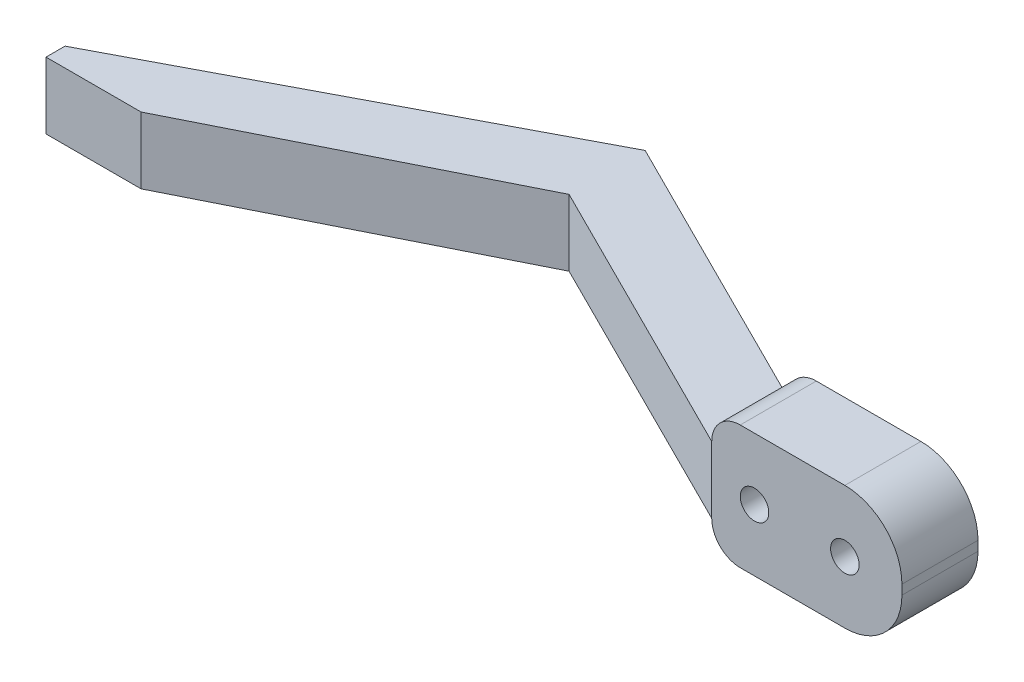
ISO-10303-21;
HEADER;
FILE_DESCRIPTION(('STEP AP214'),'2;1');
FILE_NAME('part.step','',(''),(''),'','','');
FILE_SCHEMA(('AUTOMOTIVE_DESIGN { 1 0 10303 214 1 1 1 1 }'));
ENDSEC;
DATA;
#1=APPLICATION_CONTEXT('core data for automotive mechanical design processes');
#2=APPLICATION_PROTOCOL_DEFINITION('international standard','automotive_design',2000,#1);
#3=PRODUCT_CONTEXT('',#1,'mechanical');
#4=PRODUCT('Part','Part','',(#3));
#5=PRODUCT_RELATED_PRODUCT_CATEGORY('part','',(#4));
#6=PRODUCT_DEFINITION_FORMATION('','',#4);
#7=PRODUCT_DEFINITION_CONTEXT('part definition',#1,'design');
#8=PRODUCT_DEFINITION('design','',#6,#7);
#9=PRODUCT_DEFINITION_SHAPE('','',#8);
#10=(LENGTH_UNIT() NAMED_UNIT(*) SI_UNIT(.MILLI.,.METRE.));
#11=(NAMED_UNIT(*) PLANE_ANGLE_UNIT() SI_UNIT($,.RADIAN.));
#12=(NAMED_UNIT(*) SI_UNIT($,.STERADIAN.) SOLID_ANGLE_UNIT());
#13=UNCERTAINTY_MEASURE_WITH_UNIT(LENGTH_MEASURE(1.E-05),#10,'distance_accuracy_value','');
#14=(GEOMETRIC_REPRESENTATION_CONTEXT(3) GLOBAL_UNCERTAINTY_ASSIGNED_CONTEXT((#13)) GLOBAL_UNIT_ASSIGNED_CONTEXT((#10,
#11,#12)) REPRESENTATION_CONTEXT('',''));
#15=CARTESIAN_POINT('',(0.,0.,0.));
#16=DIRECTION('',(0.,0.,1.));
#17=DIRECTION('',(1.,0.,0.));
#18=AXIS2_PLACEMENT_3D('',#15,#16,#17);
#19=CARTESIAN_POINT('',(50.,7.,0.));
#20=DIRECTION('',(-1.,0.,0.));
#21=DIRECTION('',(0.,0.,1.));
#22=AXIS2_PLACEMENT_3D('',#19,#20,#21);
#23=PLANE('',#22);
#24=DIRECTION('',(0.,-1.,0.));
#25=VECTOR('',#24,1.);
#26=CARTESIAN_POINT('',(50.,7.,-8.));
#27=LINE('',#26,#25);
#28=CARTESIAN_POINT('',(50.,4.,-8.));
#29=VERTEX_POINT('',#28);
#30=CARTESIAN_POINT('',(50.,3.,-8.));
#31=VERTEX_POINT('',#30);
#32=EDGE_CURVE('E217',#29,#31,#27,.T.);
#33=ORIENTED_EDGE('',*,*,#32,.F.);
#34=DIRECTION('',(0.,0.,-1.));
#35=VECTOR('',#34,1.);
#36=CARTESIAN_POINT('',(50.,4.,0.));
#37=LINE('',#36,#35);
#38=CARTESIAN_POINT('',(50.,4.,0.));
#39=VERTEX_POINT('',#38);
#40=EDGE_CURVE('E233',#29,#39,#37,.F.);
#41=ORIENTED_EDGE('',*,*,#40,.T.);
#42=DIRECTION('',(0.,-1.,0.));
#43=VECTOR('',#42,1.);
#44=CARTESIAN_POINT('',(50.,7.,0.));
#45=LINE('',#44,#43);
#46=CARTESIAN_POINT('',(50.,3.,0.));
#47=VERTEX_POINT('',#46);
#48=EDGE_CURVE('E158',#39,#47,#45,.T.);
#49=ORIENTED_EDGE('',*,*,#48,.T.);
#50=DIRECTION('',(0.,0.,-1.));
#51=VECTOR('',#50,1.);
#52=CARTESIAN_POINT('',(50.,3.,0.));
#53=LINE('',#52,#51);
#54=EDGE_CURVE('E230',#47,#31,#53,.T.);
#55=ORIENTED_EDGE('',*,*,#54,.T.);
#56=EDGE_LOOP('',(#33,#41,#49,#55));
#57=FACE_BOUND('',#56,.T.);
#58=ADVANCED_FACE('F37',(#57),#23,.F.);
#59=CARTESIAN_POINT('',(0.,7.,-8.));
#60=DIRECTION('',(0.,0.,1.));
#61=DIRECTION('',(1.,0.,0.));
#62=AXIS2_PLACEMENT_3D('',#59,#60,#61);
#63=PLANE('',#62);
#64=CARTESIAN_POINT('',(44.,3.5,-8.));
#65=DIRECTION('',(0.,0.,-1.));
#66=DIRECTION('',(-1.,0.,0.));
#67=AXIS2_PLACEMENT_3D('',#64,#65,#66);
#68=CIRCLE('',#67,1.5);
#69=CARTESIAN_POINT('',(42.5,3.5,-8.));
#70=VERTEX_POINT('',#69);
#71=EDGE_CURVE('E283',#70,#70,#68,.T.);
#72=ORIENTED_EDGE('',*,*,#71,.F.);
#73=EDGE_LOOP('',(#72));
#74=FACE_BOUND('',#73,.T.);
#75=CARTESIAN_POINT('',(34.5,3.5,-8.));
#76=DIRECTION('',(0.,0.,-1.));
#77=DIRECTION('',(-1.,0.,0.));
#78=AXIS2_PLACEMENT_3D('',#75,#76,#77);
#79=CIRCLE('',#78,1.5);
#80=CARTESIAN_POINT('',(33.,3.5,-8.));
#81=VERTEX_POINT('',#80);
#82=EDGE_CURVE('E275',#81,#81,#79,.T.);
#83=ORIENTED_EDGE('',*,*,#82,.F.);
#84=EDGE_LOOP('',(#83));
#85=FACE_BOUND('',#84,.T.);
#86=DIRECTION('',(-1.,0.,0.));
#87=VECTOR('',#86,1.);
#88=CARTESIAN_POINT('',(50.,-3.,-8.));
#89=LINE('',#88,#87);
#90=CARTESIAN_POINT('',(44.,-3.,-8.));
#91=VERTEX_POINT('',#90);
#92=CARTESIAN_POINT('',(33.,-3.,-8.));
#93=VERTEX_POINT('',#92);
#94=EDGE_CURVE('E175',#91,#93,#89,.T.);
#95=ORIENTED_EDGE('',*,*,#94,.T.);
#96=CARTESIAN_POINT('',(33.,0.,-8.));
#97=DIRECTION('',(0.,0.,1.));
#98=DIRECTION('',(1.,0.,0.));
#99=AXIS2_PLACEMENT_3D('',#96,#97,#98);
#100=CIRCLE('',#99,3.);
#101=CARTESIAN_POINT('',(30.,0.,-8.));
#102=VERTEX_POINT('',#101);
#103=EDGE_CURVE('E45',#93,#102,#100,.F.);
#104=ORIENTED_EDGE('',*,*,#103,.T.);
#105=DIRECTION('',(0.,-1.,0.));
#106=VECTOR('',#105,1.);
#107=CARTESIAN_POINT('',(30.,7.,-8.));
#108=LINE('',#107,#106);
#109=CARTESIAN_POINT('',(30.,7.,-8.));
#110=VERTEX_POINT('',#109);
#111=EDGE_CURVE('E214',#110,#102,#108,.T.);
#112=ORIENTED_EDGE('',*,*,#111,.F.);
#113=CARTESIAN_POINT('',(33.,7.,-8.));
#114=DIRECTION('',(0.,0.,1.));
#115=DIRECTION('',(1.,0.,0.));
#116=AXIS2_PLACEMENT_3D('',#113,#114,#115);
#117=CIRCLE('',#116,3.);
#118=CARTESIAN_POINT('',(33.,10.,-8.));
#119=VERTEX_POINT('',#118);
#120=EDGE_CURVE('E52',#110,#119,#117,.F.);
#121=ORIENTED_EDGE('',*,*,#120,.T.);
#122=DIRECTION('',(-1.,0.,0.));
#123=VECTOR('',#122,1.);
#124=CARTESIAN_POINT('',(50.,10.,-8.));
#125=LINE('',#124,#123);
#126=CARTESIAN_POINT('',(44.,10.,-8.));
#127=VERTEX_POINT('',#126);
#128=EDGE_CURVE('E270',#127,#119,#125,.T.);
#129=ORIENTED_EDGE('',*,*,#128,.F.);
#130=CARTESIAN_POINT('',(44.,4.,-8.));
#131=DIRECTION('',(0.,0.,1.));
#132=DIRECTION('',(1.,0.,0.));
#133=AXIS2_PLACEMENT_3D('',#130,#131,#132);
#134=CIRCLE('',#133,6.);
#135=EDGE_CURVE('E228',#127,#29,#134,.F.);
#136=ORIENTED_EDGE('',*,*,#135,.T.);
#137=ORIENTED_EDGE('',*,*,#32,.T.);
#138=CARTESIAN_POINT('',(44.,3.,-8.));
#139=DIRECTION('',(0.,0.,1.));
#140=DIRECTION('',(1.,0.,0.));
#141=AXIS2_PLACEMENT_3D('',#138,#139,#140);
#142=CIRCLE('',#141,6.);
#143=EDGE_CURVE('E226',#31,#91,#142,.F.);
#144=ORIENTED_EDGE('',*,*,#143,.T.);
#145=EDGE_LOOP('',(#95,#104,#112,#121,#129,#136,#137,#144));
#146=FACE_BOUND('',#145,.T.);
#147=ADVANCED_FACE('F244',(#74,#85,#146),#63,.F.);
#148=CARTESIAN_POINT('',(9.2,7.,-18.4));
#149=DIRECTION('',(0.447213595499958,0.,-0.894427190999916));
#150=DIRECTION('',(-0.894427190999916,0.,-0.447213595499958));
#151=AXIS2_PLACEMENT_3D('',#148,#149,#150);
#152=PLANE('',#151);
#153=DIRECTION('',(0.894427190999916,0.,0.447213595499958));
#154=VECTOR('',#153,1.);
#155=CARTESIAN_POINT('',(9.2,0.,-18.4));
#156=LINE('',#155,#154);
#157=CARTESIAN_POINT('',(0.,0.,-23.));
#158=VERTEX_POINT('',#157);
#159=EDGE_CURVE('E169',#158,#102,#156,.T.);
#160=ORIENTED_EDGE('',*,*,#159,.F.);
#161=DIRECTION('',(0.,-1.,0.));
#162=VECTOR('',#161,1.);
#163=CARTESIAN_POINT('',(0.,7.,-23.));
#164=LINE('',#163,#162);
#165=CARTESIAN_POINT('',(0.,7.,-23.));
#166=VERTEX_POINT('',#165);
#167=EDGE_CURVE('E212',#166,#158,#164,.T.);
#168=ORIENTED_EDGE('',*,*,#167,.F.);
#169=DIRECTION('',(0.894427190999916,0.,0.447213595499958));
#170=VECTOR('',#169,1.);
#171=CARTESIAN_POINT('',(9.2,7.,-18.4));
#172=LINE('',#171,#170);
#173=EDGE_CURVE('E179',#166,#110,#172,.T.);
#174=ORIENTED_EDGE('',*,*,#173,.T.);
#175=ORIENTED_EDGE('',*,*,#111,.T.);
#176=EDGE_LOOP('',(#160,#168,#174,#175));
#177=FACE_BOUND('',#176,.T.);
#178=ADVANCED_FACE('F249',(#177),#152,.T.);
#179=CARTESIAN_POINT('',(-9.46594806467418,7.,-18.0303772660461));
#180=DIRECTION('',(-0.46483389898992,0.,-0.885397902837944));
#181=DIRECTION('',(-0.885397902837944,0.,0.46483389898992));
#182=AXIS2_PLACEMENT_3D('',#179,#180,#181);
#183=PLANE('',#182);
#184=DIRECTION('',(0.885397902837944,0.,-0.46483389898992));
#185=VECTOR('',#184,1.);
#186=CARTESIAN_POINT('',(-9.46594806467418,0.,-18.0303772660461));
#187=LINE('',#186,#185);
#188=CARTESIAN_POINT('',(-40.,0.,-2.));
#189=VERTEX_POINT('',#188);
#190=EDGE_CURVE('E173',#189,#158,#187,.T.);
#191=ORIENTED_EDGE('',*,*,#190,.F.);
#192=DIRECTION('',(0.,-1.,0.));
#193=VECTOR('',#192,1.);
#194=CARTESIAN_POINT('',(-40.,7.,-2.));
#195=LINE('',#194,#193);
#196=CARTESIAN_POINT('',(-40.,7.,-2.));
#197=VERTEX_POINT('',#196);
#198=EDGE_CURVE('E210',#197,#189,#195,.T.);
#199=ORIENTED_EDGE('',*,*,#198,.F.);
#200=DIRECTION('',(0.885397902837944,0.,-0.46483389898992));
#201=VECTOR('',#200,1.);
#202=CARTESIAN_POINT('',(-9.46594806467418,7.,-18.0303772660461));
#203=LINE('',#202,#201);
#204=EDGE_CURVE('E182',#197,#166,#203,.T.);
#205=ORIENTED_EDGE('',*,*,#204,.T.);
#206=ORIENTED_EDGE('',*,*,#167,.T.);
#207=EDGE_LOOP('',(#191,#199,#205,#206));
#208=FACE_BOUND('',#207,.T.);
#209=ADVANCED_FACE('F399',(#208),#183,.T.);
#210=CARTESIAN_POINT('',(-40.,7.,0.));
#211=DIRECTION('',(-1.,0.,0.));
#212=DIRECTION('',(0.,0.,1.));
#213=AXIS2_PLACEMENT_3D('',#210,#211,#212);
#214=PLANE('',#213);
#215=DIRECTION('',(0.,0.,-1.));
#216=VECTOR('',#215,1.);
#217=CARTESIAN_POINT('',(-40.,0.,0.));
#218=LINE('',#217,#216);
#219=CARTESIAN_POINT('',(-40.,0.,0.));
#220=VERTEX_POINT('',#219);
#221=EDGE_CURVE('E194',#220,#189,#218,.T.);
#222=ORIENTED_EDGE('',*,*,#221,.F.);
#223=DIRECTION('',(0.,-1.,0.));
#224=VECTOR('',#223,1.);
#225=CARTESIAN_POINT('',(-40.,7.,0.));
#226=LINE('',#225,#224);
#227=CARTESIAN_POINT('',(-40.,7.,0.));
#228=VERTEX_POINT('',#227);
#229=EDGE_CURVE('E208',#228,#220,#226,.T.);
#230=ORIENTED_EDGE('',*,*,#229,.F.);
#231=DIRECTION('',(0.,0.,-1.));
#232=VECTOR('',#231,1.);
#233=CARTESIAN_POINT('',(-40.,7.,0.));
#234=LINE('',#233,#232);
#235=EDGE_CURVE('E185',#228,#197,#234,.T.);
#236=ORIENTED_EDGE('',*,*,#235,.T.);
#237=ORIENTED_EDGE('',*,*,#198,.T.);
#238=EDGE_LOOP('',(#222,#230,#236,#237));
#239=FACE_BOUND('',#238,.T.);
#240=ADVANCED_FACE('F437',(#239),#214,.T.);
#241=CARTESIAN_POINT('',(0.,7.,0.));
#242=DIRECTION('',(0.,0.,1.));
#243=DIRECTION('',(1.,0.,0.));
#244=AXIS2_PLACEMENT_3D('',#241,#242,#243);
#245=PLANE('',#244);
#246=DIRECTION('',(-1.,0.,0.));
#247=VECTOR('',#246,1.);
#248=CARTESIAN_POINT('',(0.,0.,0.));
#249=LINE('',#248,#247);
#250=CARTESIAN_POINT('',(-30.,0.,0.));
#251=VERTEX_POINT('',#250);
#252=EDGE_CURVE('E197',#251,#220,#249,.T.);
#253=ORIENTED_EDGE('',*,*,#252,.F.);
#254=DIRECTION('',(0.,-1.,0.));
#255=VECTOR('',#254,1.);
#256=CARTESIAN_POINT('',(-30.,7.,0.));
#257=LINE('',#256,#255);
#258=CARTESIAN_POINT('',(-30.,7.,0.));
#259=VERTEX_POINT('',#258);
#260=EDGE_CURVE('E206',#259,#251,#257,.T.);
#261=ORIENTED_EDGE('',*,*,#260,.F.);
#262=DIRECTION('',(-1.,0.,0.));
#263=VECTOR('',#262,1.);
#264=CARTESIAN_POINT('',(0.,7.,0.));
#265=LINE('',#264,#263);
#266=EDGE_CURVE('E188',#259,#228,#265,.T.);
#267=ORIENTED_EDGE('',*,*,#266,.T.);
#268=ORIENTED_EDGE('',*,*,#229,.T.);
#269=EDGE_LOOP('',(#253,#261,#267,#268));
#270=FACE_BOUND('',#269,.T.);
#271=ADVANCED_FACE('F428',(#270),#245,.T.);
#272=CARTESIAN_POINT('',(-6.,7.,-12.));
#273=DIRECTION('',(-0.447213595499958,0.,-0.894427190999916));
#274=DIRECTION('',(-0.894427190999916,0.,0.447213595499958));
#275=AXIS2_PLACEMENT_3D('',#272,#273,#274);
#276=PLANE('',#275);
#277=DIRECTION('',(0.894427190999916,0.,-0.447213595499958));
#278=VECTOR('',#277,1.);
#279=CARTESIAN_POINT('',(-6.,0.,-12.));
#280=LINE('',#279,#278);
#281=CARTESIAN_POINT('',(0.,0.,-15.));
#282=VERTEX_POINT('',#281);
#283=EDGE_CURVE('E200',#251,#282,#280,.T.);
#284=ORIENTED_EDGE('',*,*,#283,.T.);
#285=DIRECTION('',(0.,-1.,0.));
#286=VECTOR('',#285,1.);
#287=CARTESIAN_POINT('',(0.,7.,-15.));
#288=LINE('',#287,#286);
#289=CARTESIAN_POINT('',(0.,7.,-15.));
#290=VERTEX_POINT('',#289);
#291=EDGE_CURVE('E157',#290,#282,#288,.T.);
#292=ORIENTED_EDGE('',*,*,#291,.F.);
#293=DIRECTION('',(0.894427190999916,0.,-0.447213595499958));
#294=VECTOR('',#293,1.);
#295=CARTESIAN_POINT('',(-6.,7.,-12.));
#296=LINE('',#295,#294);
#297=EDGE_CURVE('E166',#259,#290,#296,.T.);
#298=ORIENTED_EDGE('',*,*,#297,.F.);
#299=ORIENTED_EDGE('',*,*,#260,.T.);
#300=EDGE_LOOP('',(#284,#292,#298,#299));
#301=FACE_BOUND('',#300,.T.);
#302=ADVANCED_FACE('F407',(#301),#276,.F.);
#303=CARTESIAN_POINT('',(6.,7.,-12.));
#304=DIRECTION('',(0.447213595499958,0.,-0.894427190999916));
#305=DIRECTION('',(-0.894427190999916,0.,-0.447213595499958));
#306=AXIS2_PLACEMENT_3D('',#303,#304,#305);
#307=PLANE('',#306);
#308=DIRECTION('',(0.894427190999916,0.,0.447213595499958));
#309=VECTOR('',#308,1.);
#310=CARTESIAN_POINT('',(6.,0.,-12.));
#311=LINE('',#310,#309);
#312=CARTESIAN_POINT('',(30.,0.,0.));
#313=VERTEX_POINT('',#312);
#314=EDGE_CURVE('E156',#282,#313,#311,.T.);
#315=ORIENTED_EDGE('',*,*,#314,.T.);
#316=DIRECTION('',(0.,-1.,0.));
#317=VECTOR('',#316,1.);
#318=CARTESIAN_POINT('',(30.,7.,0.));
#319=LINE('',#318,#317);
#320=CARTESIAN_POINT('',(30.,7.,0.));
#321=VERTEX_POINT('',#320);
#322=EDGE_CURVE('E139',#321,#313,#319,.T.);
#323=ORIENTED_EDGE('',*,*,#322,.F.);
#324=DIRECTION('',(0.894427190999916,0.,0.447213595499958));
#325=VECTOR('',#324,1.);
#326=CARTESIAN_POINT('',(6.,7.,-12.));
#327=LINE('',#326,#325);
#328=EDGE_CURVE('E154',#290,#321,#327,.T.);
#329=ORIENTED_EDGE('',*,*,#328,.F.);
#330=ORIENTED_EDGE('',*,*,#291,.T.);
#331=EDGE_LOOP('',(#315,#323,#329,#330));
#332=FACE_BOUND('',#331,.T.);
#333=ADVANCED_FACE('F152',(#332),#307,.F.);
#334=CARTESIAN_POINT('',(0.,7.,0.));
#335=DIRECTION('',(0.,0.,-1.));
#336=DIRECTION('',(-1.,0.,0.));
#337=AXIS2_PLACEMENT_3D('',#334,#335,#336);
#338=PLANE('',#337);
#339=CARTESIAN_POINT('',(44.,3.5,0.));
#340=DIRECTION('',(0.,0.,-1.));
#341=DIRECTION('',(-1.,0.,0.));
#342=AXIS2_PLACEMENT_3D('',#339,#340,#341);
#343=CIRCLE('',#342,1.5);
#344=CARTESIAN_POINT('',(42.5,3.5,0.));
#345=VERTEX_POINT('',#344);
#346=EDGE_CURVE('E280',#345,#345,#343,.T.);
#347=ORIENTED_EDGE('',*,*,#346,.T.);
#348=EDGE_LOOP('',(#347));
#349=FACE_BOUND('',#348,.T.);
#350=CARTESIAN_POINT('',(34.5,3.5,0.));
#351=DIRECTION('',(0.,0.,-1.));
#352=DIRECTION('',(-1.,0.,0.));
#353=AXIS2_PLACEMENT_3D('',#350,#351,#352);
#354=CIRCLE('',#353,1.5);
#355=CARTESIAN_POINT('',(33.,3.5,0.));
#356=VERTEX_POINT('',#355);
#357=EDGE_CURVE('E271',#356,#356,#354,.T.);
#358=ORIENTED_EDGE('',*,*,#357,.T.);
#359=EDGE_LOOP('',(#358));
#360=FACE_BOUND('',#359,.T.);
#361=ORIENTED_EDGE('',*,*,#322,.T.);
#362=CARTESIAN_POINT('',(33.,0.,0.));
#363=DIRECTION('',(0.,0.,-1.));
#364=DIRECTION('',(-1.,0.,0.));
#365=AXIS2_PLACEMENT_3D('',#362,#363,#364);
#366=CIRCLE('',#365,3.);
#367=CARTESIAN_POINT('',(33.,-3.,0.));
#368=VERTEX_POINT('',#367);
#369=EDGE_CURVE('E145',#313,#368,#366,.F.);
#370=ORIENTED_EDGE('',*,*,#369,.T.);
#371=DIRECTION('',(1.,0.,0.));
#372=VECTOR('',#371,1.);
#373=CARTESIAN_POINT('',(30.,-3.,0.));
#374=LINE('',#373,#372);
#375=CARTESIAN_POINT('',(44.,-3.,0.));
#376=VERTEX_POINT('',#375);
#377=EDGE_CURVE('E170',#368,#376,#374,.T.);
#378=ORIENTED_EDGE('',*,*,#377,.T.);
#379=CARTESIAN_POINT('',(44.,3.,0.));
#380=DIRECTION('',(0.,0.,-1.));
#381=DIRECTION('',(-1.,0.,0.));
#382=AXIS2_PLACEMENT_3D('',#379,#380,#381);
#383=CIRCLE('',#382,6.);
#384=EDGE_CURVE('E235',#376,#47,#383,.F.);
#385=ORIENTED_EDGE('',*,*,#384,.T.);
#386=ORIENTED_EDGE('',*,*,#48,.F.);
#387=CARTESIAN_POINT('',(44.,4.,0.));
#388=DIRECTION('',(0.,0.,-1.));
#389=DIRECTION('',(-1.,0.,0.));
#390=AXIS2_PLACEMENT_3D('',#387,#388,#389);
#391=CIRCLE('',#390,6.);
#392=CARTESIAN_POINT('',(44.,10.,0.));
#393=VERTEX_POINT('',#392);
#394=EDGE_CURVE('E237',#39,#393,#391,.F.);
#395=ORIENTED_EDGE('',*,*,#394,.T.);
#396=DIRECTION('',(1.,0.,0.));
#397=VECTOR('',#396,1.);
#398=CARTESIAN_POINT('',(30.,10.,0.));
#399=LINE('',#398,#397);
#400=CARTESIAN_POINT('',(33.,10.,0.));
#401=VERTEX_POINT('',#400);
#402=EDGE_CURVE('E141',#401,#393,#399,.T.);
#403=ORIENTED_EDGE('',*,*,#402,.F.);
#404=CARTESIAN_POINT('',(33.,7.,0.));
#405=DIRECTION('',(0.,0.,-1.));
#406=DIRECTION('',(-1.,0.,0.));
#407=AXIS2_PLACEMENT_3D('',#404,#405,#406);
#408=CIRCLE('',#407,3.);
#409=EDGE_CURVE('E136',#401,#321,#408,.F.);
#410=ORIENTED_EDGE('',*,*,#409,.T.);
#411=EDGE_LOOP('',(#361,#370,#378,#385,#386,#395,#403,#410));
#412=FACE_BOUND('',#411,.T.);
#413=ADVANCED_FACE('F138',(#349,#360,#412),#338,.F.);
#414=CARTESIAN_POINT('',(0.,7.,0.));
#415=DIRECTION('',(0.,1.,0.));
#416=DIRECTION('',(0.,0.,1.));
#417=AXIS2_PLACEMENT_3D('',#414,#415,#416);
#418=PLANE('',#417);
#419=DIRECTION('',(0.,0.,1.));
#420=VECTOR('',#419,1.);
#421=CARTESIAN_POINT('',(30.,7.,0.));
#422=LINE('',#421,#420);
#423=EDGE_CURVE('E163',#110,#321,#422,.T.);
#424=ORIENTED_EDGE('',*,*,#423,.F.);
#425=ORIENTED_EDGE('',*,*,#173,.F.);
#426=ORIENTED_EDGE('',*,*,#204,.F.);
#427=ORIENTED_EDGE('',*,*,#235,.F.);
#428=ORIENTED_EDGE('',*,*,#266,.F.);
#429=ORIENTED_EDGE('',*,*,#297,.T.);
#430=ORIENTED_EDGE('',*,*,#328,.T.);
#431=EDGE_LOOP('',(#424,#425,#426,#427,#428,#429,#430));
#432=FACE_BOUND('',#431,.T.);
#433=ADVANCED_FACE('F161',(#432),#418,.T.);
#434=CARTESIAN_POINT('',(0.,0.,0.));
#435=DIRECTION('',(0.,1.,0.));
#436=DIRECTION('',(0.,0.,1.));
#437=AXIS2_PLACEMENT_3D('',#434,#435,#436);
#438=PLANE('',#437);
#439=ORIENTED_EDGE('',*,*,#159,.T.);
#440=DIRECTION('',(0.,0.,1.));
#441=VECTOR('',#440,1.);
#442=CARTESIAN_POINT('',(30.,0.,0.));
#443=LINE('',#442,#441);
#444=EDGE_CURVE('E220',#102,#313,#443,.T.);
#445=ORIENTED_EDGE('',*,*,#444,.T.);
#446=ORIENTED_EDGE('',*,*,#314,.F.);
#447=ORIENTED_EDGE('',*,*,#283,.F.);
#448=ORIENTED_EDGE('',*,*,#252,.T.);
#449=ORIENTED_EDGE('',*,*,#221,.T.);
#450=ORIENTED_EDGE('',*,*,#190,.T.);
#451=EDGE_LOOP('',(#439,#445,#446,#447,#448,#449,#450));
#452=FACE_BOUND('',#451,.T.);
#453=ADVANCED_FACE('F251',(#452),#438,.F.);
#454=CARTESIAN_POINT('',(0.,-3.,0.));
#455=DIRECTION('',(0.,1.,0.));
#456=DIRECTION('',(0.,0.,1.));
#457=AXIS2_PLACEMENT_3D('',#454,#455,#456);
#458=PLANE('',#457);
#459=ORIENTED_EDGE('',*,*,#377,.F.);
#460=DIRECTION('',(0.,0.,1.));
#461=VECTOR('',#460,1.);
#462=CARTESIAN_POINT('',(33.,-3.,-7.99999999999999));
#463=LINE('',#462,#461);
#464=EDGE_CURVE('E60',#368,#93,#463,.F.);
#465=ORIENTED_EDGE('',*,*,#464,.T.);
#466=ORIENTED_EDGE('',*,*,#94,.F.);
#467=DIRECTION('',(0.,0.,-1.));
#468=VECTOR('',#467,1.);
#469=CARTESIAN_POINT('',(44.,-3.,0.));
#470=LINE('',#469,#468);
#471=EDGE_CURVE('E146',#91,#376,#470,.F.);
#472=ORIENTED_EDGE('',*,*,#471,.T.);
#473=EDGE_LOOP('',(#459,#465,#466,#472));
#474=FACE_BOUND('',#473,.T.);
#475=ADVANCED_FACE('F254',(#474),#458,.F.);
#476=CARTESIAN_POINT('',(0.,10.,0.));
#477=DIRECTION('',(0.,1.,0.));
#478=DIRECTION('',(0.,0.,1.));
#479=AXIS2_PLACEMENT_3D('',#476,#477,#478);
#480=PLANE('',#479);
#481=ORIENTED_EDGE('',*,*,#128,.T.);
#482=DIRECTION('',(0.,0.,1.));
#483=VECTOR('',#482,1.);
#484=CARTESIAN_POINT('',(33.,10.,0.));
#485=LINE('',#484,#483);
#486=EDGE_CURVE('E11',#119,#401,#485,.T.);
#487=ORIENTED_EDGE('',*,*,#486,.T.);
#488=ORIENTED_EDGE('',*,*,#402,.T.);
#489=DIRECTION('',(0.,0.,-1.));
#490=VECTOR('',#489,1.);
#491=CARTESIAN_POINT('',(44.,10.,-8.));
#492=LINE('',#491,#490);
#493=EDGE_CURVE('E223',#393,#127,#492,.T.);
#494=ORIENTED_EDGE('',*,*,#493,.T.);
#495=EDGE_LOOP('',(#481,#487,#488,#494));
#496=FACE_BOUND('',#495,.T.);
#497=ADVANCED_FACE('F269',(#496),#480,.T.);
#498=CARTESIAN_POINT('',(44.,4.,0.));
#499=DIRECTION('',(0.,0.,1.));
#500=DIRECTION('',(1.,0.,0.));
#501=AXIS2_PLACEMENT_3D('',#498,#499,#500);
#502=CYLINDRICAL_SURFACE('',#501,6.);
#503=ORIENTED_EDGE('',*,*,#394,.F.);
#504=ORIENTED_EDGE('',*,*,#40,.F.);
#505=ORIENTED_EDGE('',*,*,#135,.F.);
#506=ORIENTED_EDGE('',*,*,#493,.F.);
#507=EDGE_LOOP('',(#503,#504,#505,#506));
#508=FACE_BOUND('',#507,.T.);
#509=ADVANCED_FACE('F266',(#508),#502,.T.);
#510=CARTESIAN_POINT('',(44.,3.,0.));
#511=DIRECTION('',(0.,0.,-1.));
#512=DIRECTION('',(-1.,0.,0.));
#513=AXIS2_PLACEMENT_3D('',#510,#511,#512);
#514=CYLINDRICAL_SURFACE('',#513,6.);
#515=ORIENTED_EDGE('',*,*,#384,.F.);
#516=ORIENTED_EDGE('',*,*,#471,.F.);
#517=ORIENTED_EDGE('',*,*,#143,.F.);
#518=ORIENTED_EDGE('',*,*,#54,.F.);
#519=EDGE_LOOP('',(#515,#516,#517,#518));
#520=FACE_BOUND('',#519,.T.);
#521=ADVANCED_FACE('F259',(#520),#514,.T.);
#522=CARTESIAN_POINT('',(33.,0.,-7.99999999999999));
#523=DIRECTION('',(0.,0.,-1.));
#524=DIRECTION('',(-1.,0.,0.));
#525=AXIS2_PLACEMENT_3D('',#522,#523,#524);
#526=CYLINDRICAL_SURFACE('',#525,3.);
#527=ORIENTED_EDGE('',*,*,#103,.F.);
#528=ORIENTED_EDGE('',*,*,#464,.F.);
#529=ORIENTED_EDGE('',*,*,#369,.F.);
#530=ORIENTED_EDGE('',*,*,#444,.F.);
#531=EDGE_LOOP('',(#527,#528,#529,#530));
#532=FACE_BOUND('',#531,.T.);
#533=ADVANCED_FACE('F253',(#532),#526,.T.);
#534=CARTESIAN_POINT('',(33.,7.,0.));
#535=DIRECTION('',(0.,0.,1.));
#536=DIRECTION('',(1.,0.,0.));
#537=AXIS2_PLACEMENT_3D('',#534,#535,#536);
#538=CYLINDRICAL_SURFACE('',#537,3.);
#539=ORIENTED_EDGE('',*,*,#120,.F.);
#540=ORIENTED_EDGE('',*,*,#423,.T.);
#541=ORIENTED_EDGE('',*,*,#409,.F.);
#542=ORIENTED_EDGE('',*,*,#486,.F.);
#543=EDGE_LOOP('',(#539,#540,#541,#542));
#544=FACE_BOUND('',#543,.T.);
#545=ADVANCED_FACE('F39',(#544),#538,.T.);
#546=CARTESIAN_POINT('',(34.5,3.5,-8.));
#547=DIRECTION('',(0.,0.,-1.));
#548=DIRECTION('',(-1.,0.,0.));
#549=AXIS2_PLACEMENT_3D('',#546,#547,#548);
#550=CYLINDRICAL_SURFACE('',#549,1.5);
#551=ORIENTED_EDGE('',*,*,#357,.F.);
#552=EDGE_LOOP('',(#551));
#553=FACE_BOUND('',#552,.T.);
#554=ORIENTED_EDGE('',*,*,#82,.T.);
#555=EDGE_LOOP('',(#554));
#556=FACE_BOUND('',#555,.T.);
#557=ADVANCED_FACE('F294',(#553,#556),#550,.F.);
#558=CARTESIAN_POINT('',(44.,3.5,-8.));
#559=DIRECTION('',(0.,0.,-1.));
#560=DIRECTION('',(-1.,0.,0.));
#561=AXIS2_PLACEMENT_3D('',#558,#559,#560);
#562=CYLINDRICAL_SURFACE('',#561,1.5);
#563=ORIENTED_EDGE('',*,*,#346,.F.);
#564=EDGE_LOOP('',(#563));
#565=FACE_BOUND('',#564,.T.);
#566=ORIENTED_EDGE('',*,*,#71,.T.);
#567=EDGE_LOOP('',(#566));
#568=FACE_BOUND('',#567,.T.);
#569=ADVANCED_FACE('F287',(#565,#568),#562,.F.);
#570=CLOSED_SHELL('',(#58,#147,#178,#209,#240,#271,#302,#333,#413,#433,#453,#475,#497,#509,#521,
#533,#545,#557,#569));
#571=MANIFOLD_SOLID_BREP('B2',#570);
#572=ADVANCED_BREP_SHAPE_REPRESENTATION('',(#18,#571),#14);
#573=SHAPE_DEFINITION_REPRESENTATION(#9,#572);
ENDSEC;
END-ISO-10303-21;
